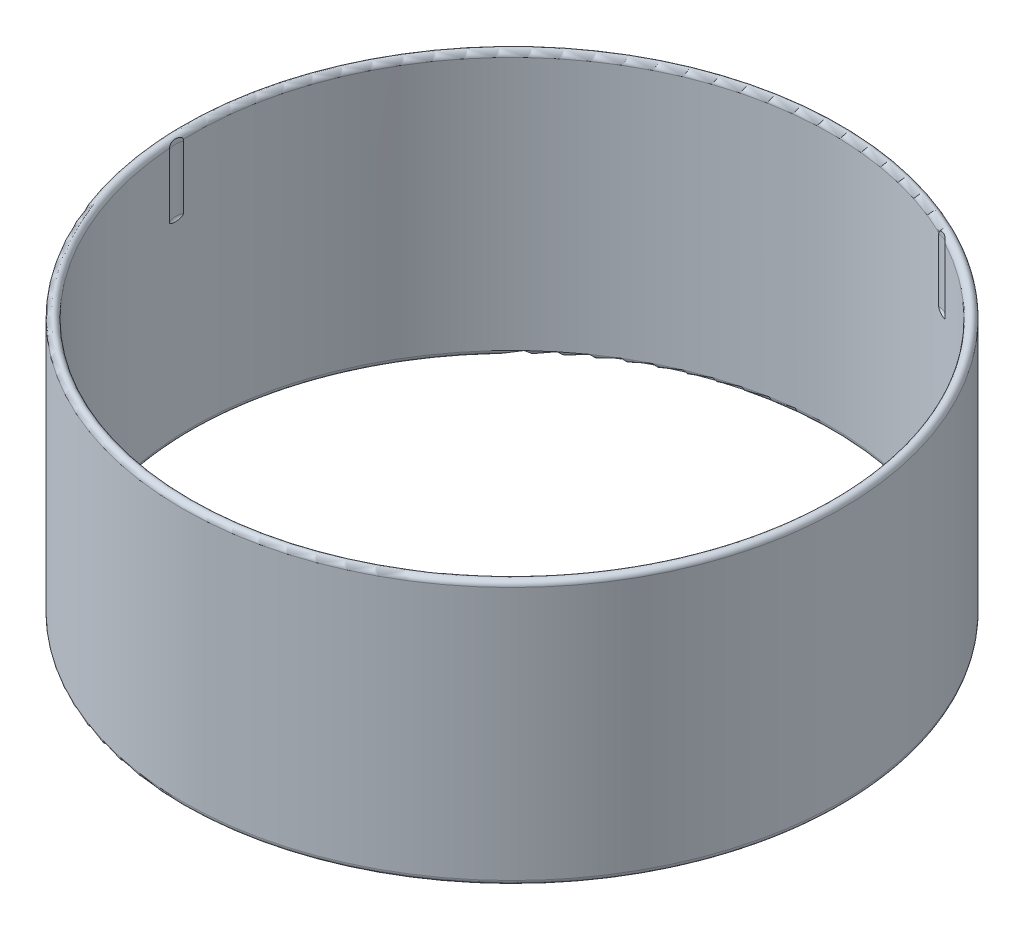
ISO-10303-21;
HEADER;
FILE_DESCRIPTION(('STEP AP214'),'2;1');
FILE_NAME('part.step','',(''),(''),'','','');
FILE_SCHEMA(('AUTOMOTIVE_DESIGN { 1 0 10303 214 1 1 1 1 }'));
ENDSEC;
DATA;
#1=APPLICATION_CONTEXT('core data for automotive mechanical design processes');
#2=APPLICATION_PROTOCOL_DEFINITION('international standard','automotive_design',2000,#1);
#3=PRODUCT_CONTEXT('',#1,'mechanical');
#4=PRODUCT('Part','Part','',(#3));
#5=PRODUCT_RELATED_PRODUCT_CATEGORY('part','',(#4));
#6=PRODUCT_DEFINITION_FORMATION('','',#4);
#7=PRODUCT_DEFINITION_CONTEXT('part definition',#1,'design');
#8=PRODUCT_DEFINITION('design','',#6,#7);
#9=PRODUCT_DEFINITION_SHAPE('','',#8);
#10=(LENGTH_UNIT() NAMED_UNIT(*) SI_UNIT(.MILLI.,.METRE.));
#11=(NAMED_UNIT(*) PLANE_ANGLE_UNIT() SI_UNIT($,.RADIAN.));
#12=(NAMED_UNIT(*) SI_UNIT($,.STERADIAN.) SOLID_ANGLE_UNIT());
#13=UNCERTAINTY_MEASURE_WITH_UNIT(LENGTH_MEASURE(1.E-05),#10,'distance_accuracy_value','');
#14=(GEOMETRIC_REPRESENTATION_CONTEXT(3) GLOBAL_UNCERTAINTY_ASSIGNED_CONTEXT((#13)) GLOBAL_UNIT_ASSIGNED_CONTEXT((#10,
#11,#12)) REPRESENTATION_CONTEXT('',''));
#15=CARTESIAN_POINT('',(0.,0.,0.));
#16=DIRECTION('',(0.,0.,1.));
#17=DIRECTION('',(1.,0.,0.));
#18=AXIS2_PLACEMENT_3D('',#15,#16,#17);
#19=CARTESIAN_POINT('',(0.,1.5,0.));
#20=DIRECTION('',(0.,1.,0.));
#21=DIRECTION('',(0.,0.,1.));
#22=AXIS2_PLACEMENT_3D('',#19,#20,#21);
#23=TOROIDAL_SURFACE('',#22,98.5,1.5);
#24=CARTESIAN_POINT('',(0.,1.5,0.));
#25=DIRECTION('',(0.,1.,0.));
#26=DIRECTION('',(0.,0.,1.));
#27=AXIS2_PLACEMENT_3D('',#24,#25,#26);
#28=CIRCLE('',#27,97.);
#29=CARTESIAN_POINT('',(0.,1.5,97.));
#30=VERTEX_POINT('',#29);
#31=EDGE_CURVE('E301',#30,#30,#28,.F.);
#32=ORIENTED_EDGE('',*,*,#31,.F.);
#33=EDGE_LOOP('',(#32));
#34=FACE_BOUND('',#33,.T.);
#35=CARTESIAN_POINT('',(0.,1.5,0.));
#36=DIRECTION('',(0.,1.,0.));
#37=DIRECTION('',(0.,0.,1.));
#38=AXIS2_PLACEMENT_3D('',#35,#36,#37);
#39=CIRCLE('',#38,100.);
#40=CARTESIAN_POINT('',(0.,1.5,100.));
#41=VERTEX_POINT('',#40);
#42=EDGE_CURVE('E304',#41,#41,#39,.T.);
#43=ORIENTED_EDGE('',*,*,#42,.F.);
#44=EDGE_LOOP('',(#43));
#45=FACE_BOUND('',#44,.T.);
#46=ADVANCED_FACE('F36',(#34,#45),#23,.T.);
#47=CARTESIAN_POINT('',(0.,78.5,0.));
#48=DIRECTION('',(0.,1.,0.));
#49=DIRECTION('',(0.,0.,1.));
#50=AXIS2_PLACEMENT_3D('',#47,#48,#49);
#51=TOROIDAL_SURFACE('',#50,98.5,1.5);
#52=CARTESIAN_POINT('',(46.0526689578262,78.4998,-85.3706722736065));
#53=CARTESIAN_POINT('',(46.0497318124486,78.5363804675937,-85.3722117880354));
#54=CARTESIAN_POINT('',(46.0445230225239,78.5725029843991,-85.3765738617317));
#55=CARTESIAN_POINT('',(46.0302037274335,78.6426342225058,-85.3900551772551));
#56=CARTESIAN_POINT('',(46.0211374033063,78.6766620313381,-85.3991207989001));
#57=CARTESIAN_POINT('',(45.9971008853054,78.750052194417,-85.4238148537515));
#58=CARTESIAN_POINT('',(45.9812396720261,78.7887604407255,-85.4404909469855));
#59=CARTESIAN_POINT('',(45.945455545345,78.8620762037317,-85.4782323530799));
#60=CARTESIAN_POINT('',(45.9255137948917,78.8966634807189,-85.4993180322984));
#61=CARTESIAN_POINT('',(45.8711014365537,78.9789261534468,-85.5563943795361));
#62=CARTESIAN_POINT('',(45.8345329825855,79.023819795135,-85.5943608111052));
#63=CARTESIAN_POINT('',(45.7562725476428,79.1052177906443,-85.6737072818365));
#64=CARTESIAN_POINT('',(45.7145715823291,79.1417071029764,-85.7150932640091));
#65=CARTESIAN_POINT('',(45.6322754479481,79.2039810730196,-85.7944610066269));
#66=CARTESIAN_POINT('',(45.5920914766667,79.2305105005739,-85.8322963574563));
#67=CARTESIAN_POINT('',(45.5092141406863,79.278971386234,-85.9081984662185));
#68=CARTESIAN_POINT('',(45.4665188920516,79.3008993345467,-85.9462653781675));
#69=CARTESIAN_POINT('',(45.3789554102592,79.3408559036101,-86.0220694880969));
#70=CARTESIAN_POINT('',(45.3340839935272,79.3588785869273,-86.0598061014744));
#71=CARTESIAN_POINT('',(45.2424847805717,79.3915307003894,-86.1344964987254));
#72=CARTESIAN_POINT('',(45.1957563909158,79.406159035422,-86.1714500264692));
#73=CARTESIAN_POINT('',(45.0697055860335,79.441009796282,-86.2679700190044));
#74=CARTESIAN_POINT('',(44.9889567399312,79.4586798351457,-86.3266067287086));
#75=CARTESIAN_POINT('',(44.8236466493903,79.4873164640379,-86.4400575139886));
#76=CARTESIAN_POINT('',(44.7390830792359,79.4982789036921,-86.4948692042638));
#77=CARTESIAN_POINT('',(44.5664830190604,79.5143098870105,-86.6002380937818));
#78=CARTESIAN_POINT('',(44.4784374551268,79.519361816571,-86.6507829313856));
#79=CARTESIAN_POINT('',(44.2996449377728,79.5238808151474,-86.7470462396979));
#80=CARTESIAN_POINT('',(44.208898766135,79.5233494850438,-86.7927660900712));
#81=CARTESIAN_POINT('',(44.0222543350958,79.5165609786111,-86.8805276478198));
#82=CARTESIAN_POINT('',(43.9262843214794,79.5101195432418,-86.9224030052652));
#83=CARTESIAN_POINT('',(43.7326549571873,79.4907478843276,-87.0005739549675));
#84=CARTESIAN_POINT('',(43.6349946205416,79.4778137413431,-87.0368661595442));
#85=CARTESIAN_POINT('',(43.439556125583,79.4445259343911,-87.1035274686093));
#86=CARTESIAN_POINT('',(43.3417820341519,79.4242163297037,-87.1339301354788));
#87=CARTESIAN_POINT('',(43.1469979655608,79.3745356774544,-87.1890082488424));
#88=CARTESIAN_POINT('',(43.049987017617,79.3451791499324,-87.2136927623901));
#89=CARTESIAN_POINT('',(42.8945225871839,79.2879327485536,-87.2493153415692));
#90=CARTESIAN_POINT('',(42.835161535731,79.2635664439894,-87.2619496253971));
#91=CARTESIAN_POINT('',(42.7184632931691,79.209312071544,-87.2850936513934));
#92=CARTESIAN_POINT('',(42.6611280382264,79.1794188827369,-87.2956014041589));
#93=CARTESIAN_POINT('',(42.5494983942893,79.1127464765747,-87.3146573224997));
#94=CARTESIAN_POINT('',(42.4952349424872,79.0759093897746,-87.3231875690532));
#95=CARTESIAN_POINT('',(42.3927293658045,78.9942109365045,-87.3383267268278));
#96=CARTESIAN_POINT('',(42.3444749213259,78.9493664622457,-87.3449396072842));
#97=CARTESIAN_POINT('',(42.275107947055,78.8702247272961,-87.3542075029825));
#98=CARTESIAN_POINT('',(42.2508165096778,78.8387881072156,-87.3573925706827));
#99=CARTESIAN_POINT('',(42.2071642139957,78.7727094411474,-87.3632150792198));
#100=CARTESIAN_POINT('',(42.1877857506938,78.738079464653,-87.3658544689606));
#101=CARTESIAN_POINT('',(42.1572423316299,78.6702394903955,-87.3703681698787));
#102=CARTESIAN_POINT('',(42.1453716063363,78.6373562201581,-87.3722962535623));
#103=CARTESIAN_POINT('',(42.1272421162013,78.5697284247038,-87.3758169493858));
#104=CARTESIAN_POINT('',(42.121039981762,78.5349687148896,-87.3774060572301));
#105=CARTESIAN_POINT('',(42.1181801112924,78.4998,-87.3788241320482));
#106=B_SPLINE_CURVE_WITH_KNOTS('',3,(#52,#53,#54,#55,#56,#57,#58,#59,#60,#61,#62,#63,#64,#65,
#66,#67,#68,#69,#70,#71,#72,#73,#74,#75,#76,#77,#78,#79,#80,#81,#82,#83,#84,#85,#86,#87,#88,#89,
#90,#91,#92,#93,#94,#95,#96,#97,#98,#99,#100,#101,#102,#103,#104,#105),.UNSPECIFIED.,.F.,.F.,(4,
2,2,2,2,2,2,2,2,2,2,2,2,2,2,2,2,2,2,2,2,2,2,2,2,2,4),(0.,0.109785182005368,0.218345457440619,
0.35270564638363,0.487700674504924,0.694259618754482,0.901185424044051,1.08463744540245,
1.2682288908119,1.45209753389321,1.63602541594606,1.93961699039069,2.24339622479165,
2.54802732901019,2.85257108915142,3.16694457847921,3.48150807364142,3.79422254589519,
4.10643771189373,4.30240635725232,4.49855749536604,4.69642203964654,4.89387400129358,
5.01309541361737,5.13188337309007,5.23644346874143,5.34203707380467),.UNSPECIFIED.);
#107=CARTESIAN_POINT('',(46.0526526591037,78.4999999999904,-85.3706810506976));
#108=VERTEX_POINT('',#107);
#109=CARTESIAN_POINT('',(42.1181967811361,78.4999999999998,-87.3788160820774));
#110=VERTEX_POINT('',#109);
#111=EDGE_CURVE('E198',#108,#110,#106,.T.);
#112=ORIENTED_EDGE('',*,*,#111,.F.);
#113=CARTESIAN_POINT('',(0.,78.5,0.));
#114=DIRECTION('',(0.,1.,0.));
#115=DIRECTION('',(0.,0.,1.));
#116=AXIS2_PLACEMENT_3D('',#113,#114,#115);
#117=CIRCLE('',#116,97.);
#118=CARTESIAN_POINT('',(54.6131760891201,78.4999999999999,80.1648364150939));
#119=VERTEX_POINT('',#118);
#120=EDGE_CURVE('E274',#119,#108,#117,.T.);
#121=ORIENTED_EDGE('',*,*,#120,.F.);
#122=CARTESIAN_POINT('',(50.9068364481866,78.4997999999998,82.5681173663554));
#123=CARTESIAN_POINT('',(50.9096382794803,78.5363804675935,82.5663434810582));
#124=CARTESIAN_POINT('',(50.9160203410768,78.5725029843989,82.5640135735086));
#125=CARTESIAN_POINT('',(50.9348551503417,78.6426342225056,82.5583533579577));
#126=CARTESIAN_POINT('',(50.947239371051,78.6766620313379,82.5550345017671));
#127=CARTESIAN_POINT('',(50.9806433088751,78.7500521944168,82.5465652939855));
#128=CARTESIAN_POINT('',(51.0030158358912,78.7887604407253,82.5411671269678));
#129=CARTESIAN_POINT('',(51.0535929156841,78.8620762037315,82.529047867257));
#130=CARTESIAN_POINT('',(51.08182452477,78.8966634807187,82.5223206443778));
#131=CARTESIAN_POINT('',(51.158460270602,78.9789261534466,82.503736333396));
#132=CARTESIAN_POINT('',(51.209624391816,79.0238197951348,82.491050339067));
#133=CARTESIAN_POINT('',(51.3174706686412,79.1052177906441,82.4629480496612));
#134=CARTESIAN_POINT('',(51.37416246322,79.1417071029761,82.4475269454235));
#135=CARTESIAN_POINT('',(51.4840450117585,79.2039810730193,82.4159402737251));
#136=CARTESIAN_POINT('',(51.5369033723785,79.2305105005736,82.4000576091853));
#137=CARTESIAN_POINT('',(51.6440751947575,79.2789713862338,82.3662347852094));
#138=CARTESIAN_POINT('',(51.6983897318663,79.3008993345465,82.3482930712454));
#139=CARTESIAN_POINT('',(51.8078197576725,79.34085590361,82.310362926534));
#140=CARTESIAN_POINT('',(51.8629363318762,79.3588785869271,82.2903714464291));
#141=CARTESIAN_POINT('',(51.973419719792,79.3915307003892,82.2483893996685));
#142=CARTESIAN_POINT('',(52.0287866084055,79.4061590354219,82.2263981910205));
#143=CARTESIAN_POINT('',(52.1754007763552,79.4410097962818,82.1654949880926));
#144=CARTESIAN_POINT('',(52.2665560796045,79.4586798351456,82.1248827908939));
#145=CARTESIAN_POINT('',(52.4474623870066,79.4873164640378,82.0384454456236));
#146=CARTESIAN_POINT('',(52.5372124882865,79.4982789036921,81.9926170907729));
#147=CARTESIAN_POINT('',(52.7147646534654,79.5143098870105,81.8958254987252));
#148=CARTESIAN_POINT('',(52.8025605488272,79.519361816571,81.8448482224701));
#149=CARTESIAN_POINT('',(52.975323277955,79.5238808151474,81.7381410145912));
#150=CARTESIAN_POINT('',(53.0602909156543,79.5233494850439,81.6824124498434));
#151=CARTESIAN_POINT('',(53.2296168696599,79.5165609786113,81.5646544099629));
#152=CARTESIAN_POINT('',(53.3138669998084,79.510119543242,81.5024796188923));
#153=CARTESIAN_POINT('',(53.4783797102346,79.4907478843278,81.3738771453479));
#154=CARTESIAN_POINT('',(53.5586398496802,79.4778137413434,81.307446915159));
#155=CARTESIAN_POINT('',(53.7140894842595,79.4445259343914,81.17152286818));
#156=CARTESIAN_POINT('',(53.7893060118268,79.4242163297041,81.1020493546035));
#157=CARTESIAN_POINT('',(53.9343970914877,79.3745356774549,80.960900459633));
#158=CARTESIAN_POINT('',(54.004279981272,79.345179149933,80.8892287710424));
#159=CARTESIAN_POINT('',(54.1128622550061,79.2879327485542,80.7724039144919));
#160=CARTESIAN_POINT('',(54.1534843914862,79.2635664439901,80.7273128778522));
#161=CARTESIAN_POINT('',(54.2318768272259,79.2093120715447,80.6378212482146));
#162=CARTESIAN_POINT('',(54.269644435529,79.1794188827376,80.5934213372845));
#163=CARTESIAN_POINT('',(54.3419621668732,79.1127464765755,80.5062751889899));
#164=CARTESIAN_POINT('',(54.3764813029902,79.0759093897754,80.4635467845089));
#165=CARTESIAN_POINT('',(54.4408449865563,78.9942109365053,80.3823439299593));
#166=CARTESIAN_POINT('',(54.4706991312632,78.9493664622465,80.3438607954235));
#167=CARTESIAN_POINT('',(54.513408851513,78.8702247272968,80.2884211813702));
#168=CARTESIAN_POINT('',(54.5283129197428,78.8387881072164,80.2689767133572));
#169=CARTESIAN_POINT('',(54.5551815078908,78.7727094411481,80.2340839706314));
#170=CARTESIAN_POINT('',(54.5671565181078,78.7380794646538,80.2186214239961));
#171=CARTESIAN_POINT('',(54.5863372073,78.6702394903962,80.1944268976272));
#172=CARTESIAN_POINT('',(54.5939423393974,78.6373562201586,80.1851105898033));
#173=CARTESIAN_POINT('',(54.6060560964872,78.5697284247041,80.1711703387004));
#174=CARTESIAN_POINT('',(54.6105333714694,78.5349687148897,80.1665936866404));
#175=CARTESIAN_POINT('',(54.6131913955211,78.4998,80.1648260035712));
#176=B_SPLINE_CURVE_WITH_KNOTS('',3,(#122,#123,#124,#125,#126,#127,#128,#129,#130,#131,#132,
#133,#134,#135,#136,#137,#138,#139,#140,#141,#142,#143,#144,#145,#146,#147,#148,#149,#150,#151,
#152,#153,#154,#155,#156,#157,#158,#159,#160,#161,#162,#163,#164,#165,#166,#167,#168,#169,#170,
#171,#172,#173,#174,#175),.UNSPECIFIED.,.F.,.F.,(4,2,2,2,2,2,2,2,2,2,2,2,2,2,2,2,2,2,2,2,2,2,2,
2,2,2,4),(0.,0.109785182005333,0.218345457440581,0.352705646383552,0.487700674504803,
0.694259618754261,0.901185424043722,1.08463744540202,1.26822889081137,1.45209753389258,
1.63602541594532,1.93961699038986,2.24339622479075,2.5480273290092,2.85257108915032,
3.16694457847806,3.4815080736402,3.7942225458939,4.10643771189239,4.30240635725119,
4.49855749536511,4.69642203964578,4.89387400129302,5.0130954136169,5.13188337308968,
5.2364434687415,5.34203707380519),.UNSPECIFIED.);
#177=CARTESIAN_POINT('',(50.9068521987318,78.4999999999904,82.5681076397932));
#178=VERTEX_POINT('',#177);
#179=EDGE_CURVE('E117',#178,#119,#176,.T.);
#180=ORIENTED_EDGE('',*,*,#179,.F.);
#181=CARTESIAN_POINT('',(-96.7313728702552,78.4999999999998,7.2139796669835));
#182=VERTEX_POINT('',#181);
#183=EDGE_CURVE('E204',#182,#178,#117,.T.);
#184=ORIENTED_EDGE('',*,*,#183,.F.);
#185=CARTESIAN_POINT('',(-96.9595054060122,78.4998,2.80255490725111));
#186=CARTESIAN_POINT('',(-96.9593700919283,78.5363804675937,2.80586830697725));
#187=CARTESIAN_POINT('',(-96.9605433636002,78.5725029843991,2.81256028822315));
#188=CARTESIAN_POINT('',(-96.9650588777746,78.6426342225058,2.83170181929744));
#189=CARTESIAN_POINT('',(-96.9683767743567,78.6766620313381,2.844086297133));
#190=CARTESIAN_POINT('',(-96.9777441941799,78.750052194417,2.87724955976595));
#191=CARTESIAN_POINT('',(-96.9842555079168,78.7887604407255,2.89932382001761));
#192=CARTESIAN_POINT('',(-96.9990484610286,78.8620762037317,2.94918448582293));
#193=CARTESIAN_POINT('',(-97.0073383196612,78.8966634807189,2.9769973879207));
#194=CARTESIAN_POINT('',(-97.0295617071553,78.9789261534468,3.05265804614008));
#195=CARTESIAN_POINT('',(-97.044157374401,79.023819795135,3.10331047203825));
#196=CARTESIAN_POINT('',(-97.0737432162837,79.1052177906443,3.21075923217545));
#197=CARTESIAN_POINT('',(-97.0887340455489,79.1417071029763,3.26756631858576));
#198=CARTESIAN_POINT('',(-97.1163204597064,79.2039810730196,3.3785207329019));
#199=CARTESIAN_POINT('',(-97.128994849045,79.2305105005739,3.43223874827117));
#200=CARTESIAN_POINT('',(-97.1532893354437,79.278971386234,3.54196368100928));
#201=CARTESIAN_POINT('',(-97.1649086239178,79.3008993345467,3.5979723069223));
#202=CARTESIAN_POINT('',(-97.1867751679317,79.3408559036102,3.71170656156305));
#203=CARTESIAN_POINT('',(-97.1970203254034,79.3588785869273,3.76943465504551));
#204=CARTESIAN_POINT('',(-97.2159045003638,79.3915307003894,3.88610709905712));
#205=CARTESIAN_POINT('',(-97.2245429993214,79.406159035422,3.94505183544889));
#206=CARTESIAN_POINT('',(-97.2451063623889,79.4410097962819,4.10247503091215));
#207=CARTESIAN_POINT('',(-97.2555128195359,79.4586798351457,4.2017239378151));
#208=CARTESIAN_POINT('',(-97.2711090363972,79.4873164640379,4.40161206836534));
#209=CARTESIAN_POINT('',(-97.2762955675228,79.4982789036922,4.50225211349137));
#210=CARTESIAN_POINT('',(-97.2812476725261,79.5143098870106,4.70441259505716));
#211=CARTESIAN_POINT('',(-97.2809980039543,79.519361816571,4.80593470891603));
#212=CARTESIAN_POINT('',(-97.2749682157282,79.5238808151474,5.00890522510736));
#213=CARTESIAN_POINT('',(-97.2691896817898,79.5233494850438,5.11035364022844));
#214=CARTESIAN_POINT('',(-97.2518712047562,79.5165609786112,5.31587323785761));
#215=CARTESIAN_POINT('',(-97.2401513212882,79.5101195432419,5.41992338637368));
#216=CARTESIAN_POINT('',(-97.2110346674223,79.4907478843277,5.6266968096204));
#217=CARTESIAN_POINT('',(-97.1936344702222,79.4778137413432,5.72941924438602));
#218=CARTESIAN_POINT('',(-97.1536456098429,79.4445259343912,5.9320046004302));
#219=CARTESIAN_POINT('',(-97.1310880459791,79.4242163297038,6.03188078087622));
#220=CARTESIAN_POINT('',(-97.081395057049,79.3745356774545,6.22810778921032));
#221=CARTESIAN_POINT('',(-97.0542669988894,79.3451791499325,6.32446399134874));
#222=CARTESIAN_POINT('',(-97.0073848421903,79.2879327485537,6.47691142707823));
#223=CARTESIAN_POINT('',(-96.9886459272174,79.2635664439895,6.53463674754582));
#224=CARTESIAN_POINT('',(-96.9503401203951,79.2093120715441,6.6472724031796));
#225=CARTESIAN_POINT('',(-96.9307724737554,79.179418882737,6.70218006687523));
#226=CARTESIAN_POINT('',(-96.8914605611624,79.1127464765749,6.80838213351056));
#227=CARTESIAN_POINT('',(-96.8717162454772,79.0759093897748,6.85964078454495));
#228=CARTESIAN_POINT('',(-96.8335743523605,78.9942109365047,6.95598279686903));
#229=CARTESIAN_POINT('',(-96.8151740525887,78.9493664622458,7.00107881186124));
#230=CARTESIAN_POINT('',(-96.7885167985676,78.8702247272962,7.06578632161266));
#231=CARTESIAN_POINT('',(-96.7791294294201,78.8387881072158,7.08841585732584));
#232=CARTESIAN_POINT('',(-96.7623457218859,78.7727094411475,7.12913110858862));
#233=CARTESIAN_POINT('',(-96.754942268801,78.7380794646531,7.14723304496481));
#234=CARTESIAN_POINT('',(-96.7435795389292,78.6702394903956,7.17594127225163));
#235=CARTESIAN_POINT('',(-96.739313945733,78.6373562201582,7.18718566375906));
#236=CARTESIAN_POINT('',(-96.7332982126876,78.5697284247039,7.20464661068539));
#237=CARTESIAN_POINT('',(-96.7315733532305,78.5349687148896,7.21081237058968));
#238=CARTESIAN_POINT('',(-96.7313715068126,78.4998,7.21399812847699));
#239=B_SPLINE_CURVE_WITH_KNOTS('',3,(#185,#186,#187,#188,#189,#190,#191,#192,#193,#194,#195,
#196,#197,#198,#199,#200,#201,#202,#203,#204,#205,#206,#207,#208,#209,#210,#211,#212,#213,#214,
#215,#216,#217,#218,#219,#220,#221,#222,#223,#224,#225,#226,#227,#228,#229,#230,#231,#232,#233,
#234,#235,#236,#237,#238),.UNSPECIFIED.,.F.,.F.,(4,2,2,2,2,2,2,2,2,2,2,2,2,2,2,2,2,2,2,2,2,2,2,
2,2,2,4),(0.,0.109785182005345,0.218345457440617,0.352705646383611,0.487700674504912,
0.694259618754471,0.90118542404404,1.08463744540244,1.26822889081188,1.45209753389318,
1.636025415946,1.93961699039063,2.2433962247916,2.54802732901013,2.85257108915136,
3.16694457847915,3.48150807364135,3.79422254589511,4.10643771189365,4.30240635725227,
4.49855749536602,4.69642203964655,4.89387400129361,5.01309541361741,5.13188337309014,
5.23644346874158,5.34203707380488),.UNSPECIFIED.);
#240=CARTESIAN_POINT('',(-96.9595048578348,78.4999999999904,2.80257341090447));
#241=VERTEX_POINT('',#240);
#242=EDGE_CURVE('E181',#241,#182,#239,.T.);
#243=ORIENTED_EDGE('',*,*,#242,.F.);
#244=EDGE_CURVE('E271',#110,#241,#117,.T.);
#245=ORIENTED_EDGE('',*,*,#244,.F.);
#246=EDGE_LOOP('',(#112,#121,#180,#184,#243,#245));
#247=FACE_BOUND('',#246,.T.);
#248=CARTESIAN_POINT('',(0.,78.5,0.));
#249=DIRECTION('',(0.,1.,0.));
#250=DIRECTION('',(0.,0.,1.));
#251=AXIS2_PLACEMENT_3D('',#248,#249,#250);
#252=CIRCLE('',#251,100.);
#253=CARTESIAN_POINT('',(0.,78.5,100.));
#254=VERTEX_POINT('',#253);
#255=EDGE_CURVE('E275',#254,#254,#252,.F.);
#256=ORIENTED_EDGE('',*,*,#255,.F.);
#257=EDGE_LOOP('',(#256));
#258=FACE_BOUND('',#257,.T.);
#259=ADVANCED_FACE('F189',(#247,#258),#51,.T.);
#260=CARTESIAN_POINT('',(0.,80.,0.));
#261=DIRECTION('',(0.,-1.,0.));
#262=DIRECTION('',(0.,0.,-1.));
#263=AXIS2_PLACEMENT_3D('',#260,#261,#262);
#264=CYLINDRICAL_SURFACE('',#263,100.);
#265=ORIENTED_EDGE('',*,*,#42,.T.);
#266=EDGE_LOOP('',(#265));
#267=FACE_BOUND('',#266,.T.);
#268=ORIENTED_EDGE('',*,*,#255,.T.);
#269=EDGE_LOOP('',(#268));
#270=FACE_BOUND('',#269,.T.);
#271=ADVANCED_FACE('F194',(#267,#270),#264,.T.);
#272=CARTESIAN_POINT('',(0.,80.,0.));
#273=DIRECTION('',(0.,-1.,0.));
#274=DIRECTION('',(0.,0.,-1.));
#275=AXIS2_PLACEMENT_3D('',#272,#273,#274);
#276=CYLINDRICAL_SURFACE('',#275,97.);
#277=CARTESIAN_POINT('',(42.1182134894496,78.5002,-87.3788080283609));
#278=CARTESIAN_POINT('',(42.1112780698639,78.4169776373383,-87.3821503934874));
#279=CARTESIAN_POINT('',(42.1060792082879,78.3336664388117,-87.384655769895));
#280=CARTESIAN_POINT('',(42.0991546040042,78.1668664386655,-87.3879925438995));
#281=CARTESIAN_POINT('',(42.0974288584383,78.0833776371922,-87.3888239428741));
#282=CARTESIAN_POINT('',(42.0974396680236,77.9998000000001,-87.3888183545075));
#283=B_SPLINE_CURVE_WITH_KNOTS('',3,(#277,#278,#279,#280,#281,#282),.UNSPECIFIED.,.F.,.F.,(4,2,
4),(0.,0.250532528533159,0.501064850881359),.UNSPECIFIED.);
#284=CARTESIAN_POINT('',(42.0974396647221,78.0000000000001,-87.388818356098));
#285=VERTEX_POINT('',#284);
#286=EDGE_CURVE('E11',#110,#285,#283,.T.);
#287=ORIENTED_EDGE('',*,*,#286,.F.);
#288=ORIENTED_EDGE('',*,*,#244,.T.);
#289=CARTESIAN_POINT('',(-96.9601678443961,77.9998000000001,2.77954161446322));
#290=CARTESIAN_POINT('',(-96.9601685361602,78.0833776371922,2.77952946545348));
#291=CARTESIAN_POINT('',(-96.9601135885494,78.1668664386655,2.78144425076084));
#292=CARTESIAN_POINT('',(-96.9598924144867,78.3336664388117,2.78912769317143));
#293=CARTESIAN_POINT('',(-96.9597261879433,78.4169776373383,2.79489635344635));
#294=CARTESIAN_POINT('',(-96.9595043219334,78.5002,2.80259195121006));
#295=B_SPLINE_CURVE_WITH_KNOTS('',3,(#289,#290,#291,#292,#293,#294),.UNSPECIFIED.,.F.,.F.,(4,2,
4),(0.,0.250532322348172,0.501064850881332),.UNSPECIFIED.);
#296=CARTESIAN_POINT('',(-96.9601678445011,78.0000000000004,2.77954161080014));
#297=VERTEX_POINT('',#296);
#298=EDGE_CURVE('E122',#297,#241,#295,.T.);
#299=ORIENTED_EDGE('',*,*,#298,.F.);
#300=DIRECTION('',(0.,1.,0.));
#301=VECTOR('',#300,1.);
#302=CARTESIAN_POINT('',(-96.960167844501,68.5000000000001,2.77954161079964));
#303=LINE('',#302,#301);
#304=CARTESIAN_POINT('',(-96.960167844501,59.,2.77954161079965));
#305=VERTEX_POINT('',#304);
#306=EDGE_CURVE('E260',#305,#297,#303,.T.);
#307=ORIENTED_EDGE('',*,*,#306,.F.);
#308=CARTESIAN_POINT('',(-96.7296565389514,59.0002,7.23695694725958));
#309=CARTESIAN_POINT('',(-96.7296506817911,58.9744198963968,7.23703145678996));
#310=CARTESIAN_POINT('',(-96.7298292030514,58.9487071753443,7.23464924239203));
#311=CARTESIAN_POINT('',(-96.7305118772708,58.898300753384,7.2255177289523));
#312=CARTESIAN_POINT('',(-96.7310130990446,58.8735999876838,7.21880773941771));
#313=CARTESIAN_POINT('',(-96.7322974713299,58.8256883435595,7.2015758610368));
#314=CARTESIAN_POINT('',(-96.7330797736087,58.8024732275032,7.19106544036699));
#315=CARTESIAN_POINT('',(-96.7348725206271,58.7577065303581,7.16690917599664));
#316=CARTESIAN_POINT('',(-96.7358835047781,58.7361590468087,7.1532559176528));
#317=CARTESIAN_POINT('',(-96.7388204898117,58.6809896657303,7.11345389231347));
#318=CARTESIAN_POINT('',(-96.7409047305077,58.6489883376017,7.08507515037372));
#319=CARTESIAN_POINT('',(-96.7453752870578,58.5897290068509,7.02376764390875));
#320=CARTESIAN_POINT('',(-96.7477624146738,58.5624842365204,6.99082662955335));
#321=CARTESIAN_POINT('',(-96.7524239334187,58.5150836246454,6.92599409254155));
#322=CARTESIAN_POINT('',(-96.7546789732502,58.494471552557,6.8944286786565));
#323=CARTESIAN_POINT('',(-96.75927399546,58.4560336362098,6.82963800845027));
#324=CARTESIAN_POINT('',(-96.7616140470128,58.4382101265572,6.79641139173882));
#325=CARTESIAN_POINT('',(-96.7687082106668,58.3882897700842,6.69490050922306));
#326=CARTESIAN_POINT('',(-96.7735314650463,58.3597889799074,6.6248526421671));
#327=CARTESIAN_POINT('',(-96.7818058387205,58.3170773172631,6.50266791016411));
#328=CARTESIAN_POINT('',(-96.7852568597243,58.3011079301043,6.45110626130794));
#329=CARTESIAN_POINT('',(-96.79213119079,58.272202228013,6.34712938037768));
#330=CARTESIAN_POINT('',(-96.7955544971806,58.2592663087827,6.29471403789578));
#331=CARTESIAN_POINT('',(-96.8057601325372,58.2241692473319,6.13644710409939));
#332=CARTESIAN_POINT('',(-96.8124654787342,58.2057793699136,6.02976176888594));
#333=CARTESIAN_POINT('',(-96.825615722734,58.1760501088268,5.81479433817966));
#334=CARTESIAN_POINT('',(-96.8320587319362,58.1647554852131,5.70650643119565));
#335=CARTESIAN_POINT('',(-96.8445974945648,58.14764001601,5.48960150573038));
#336=CARTESIAN_POINT('',(-96.8506935837933,58.1418137896019,5.38098491649809));
#337=CARTESIAN_POINT('',(-96.8627439928411,58.1345488983665,5.15960891966101));
#338=CARTESIAN_POINT('',(-96.8686849251418,58.1332788902976,5.04684359519634));
#339=CARTESIAN_POINT('',(-96.8801737844549,58.1353703735295,4.82127419542173));
#340=CARTESIAN_POINT('',(-96.8857215102508,58.1387342183839,4.70847012953397));
#341=CARTESIAN_POINT('',(-96.8963737497757,58.1506442732329,4.48389394203984));
#342=CARTESIAN_POINT('',(-96.9014810770426,58.1591542864074,4.3721200988727));
#343=CARTESIAN_POINT('',(-96.911278355697,58.1827380491011,4.14928125939514));
#344=CARTESIAN_POINT('',(-96.9159686412232,58.1978064858137,4.03821576300832));
#345=CARTESIAN_POINT('',(-96.9232711016628,58.2298624188801,3.85803373860933));
#346=CARTESIAN_POINT('',(-96.9260155204563,58.2441285282223,3.78844330851348));
#347=CARTESIAN_POINT('',(-96.9313291750962,58.2773863721317,3.6499642900499));
#348=CARTESIAN_POINT('',(-96.9338974133146,58.2964025740273,3.58108132041483));
#349=CARTESIAN_POINT('',(-96.9380269473143,58.3333584507334,3.46713971054176));
#350=CARTESIAN_POINT('',(-96.9396459917396,58.3496696132428,3.42155809605062));
#351=CARTESIAN_POINT('',(-96.9427772641553,58.3856398089602,3.33165983450237));
#352=CARTESIAN_POINT('',(-96.9442893951038,58.4053018298114,3.28734435787419));
#353=CARTESIAN_POINT('',(-96.9471777801729,58.4484882814014,3.20102652629039));
#354=CARTESIAN_POINT('',(-96.9485549825843,58.4719821127063,3.15900910818888));
#355=CARTESIAN_POINT('',(-96.9511587211606,58.5237338203778,3.07805956662292));
#356=CARTESIAN_POINT('',(-96.9523856211093,58.5519797848478,3.03912007801582));
#357=CARTESIAN_POINT('',(-96.9542756837683,58.6039235709316,2.97809204436419));
#358=CARTESIAN_POINT('',(-96.9549913864706,58.6260529553315,2.95467902074303));
#359=CARTESIAN_POINT('',(-96.9563184219977,58.6731572846261,2.91080717932309));
#360=CARTESIAN_POINT('',(-96.9569296655957,58.698134632133,2.89035088938107));
#361=CARTESIAN_POINT('',(-96.9580273831948,58.7513429843533,2.8532919305765));
#362=CARTESIAN_POINT('',(-96.9585121330633,58.7796120437308,2.83674277934979));
#363=CARTESIAN_POINT('',(-96.9593101927994,58.8387519479093,2.80933412108339));
#364=CARTESIAN_POINT('',(-96.9596241814021,58.8696119209246,2.79845209600668));
#365=CARTESIAN_POINT('',(-96.9599465094347,58.9174371152345,2.78725437488554));
#366=CARTESIAN_POINT('',(-96.9600292305095,58.9338233728688,2.78437383898178));
#367=CARTESIAN_POINT('',(-96.9601401894299,58.9668672487564,2.78050640482715));
#368=CARTESIAN_POINT('',(-96.9601682613495,58.9835255390493,2.77952527360366));
#369=CARTESIAN_POINT('',(-96.9601678431547,59.0002,2.77954165776983));
#370=B_SPLINE_CURVE_WITH_KNOTS('',3,(#308,#309,#310,#311,#312,#313,#314,#315,#316,#317,#318,
#319,#320,#321,#322,#323,#324,#325,#326,#327,#328,#329,#330,#331,#332,#333,#334,#335,#336,#337,
#338,#339,#340,#341,#342,#343,#344,#345,#346,#347,#348,#349,#350,#351,#352,#353,#354,#355,#356,
#357,#358,#359,#360,#361,#362,#363,#364,#365,#366,#367,#368,#369),.UNSPECIFIED.,.F.,.F.,(4,2,2,
2,2,2,2,2,2,2,2,2,2,2,2,2,2,2,2,2,2,2,2,2,2,2,2,2,2,2,4),(0.,0.077119909894093,
0.153549014606177,0.229749385788498,0.306131407055271,0.433860582482006,0.56193961448775,
0.675072510243415,0.788299620671268,1.01499647932979,1.17718564368397,1.33939595312751,
1.66440511339611,1.9914445146006,2.31816177565927,2.65685503670889,2.99572038493226,
3.33222952378865,3.66846657131872,3.88162778165586,4.09591046448188,4.24112743428784,
4.38647456427054,4.53071323394927,4.6745955935669,4.77106484048272,4.86761608193748,
4.96542168478521,5.06283563848304,5.11264870649991,5.16261278264348),.UNSPECIFIED.);
#371=CARTESIAN_POINT('',(-96.7296565354455,59.,7.23695699411805));
#372=VERTEX_POINT('',#371);
#373=EDGE_CURVE('E255',#372,#305,#370,.T.);
#374=ORIENTED_EDGE('',*,*,#373,.F.);
#375=DIRECTION('',(0.,1.,0.));
#376=VECTOR('',#375,1.);
#377=CARTESIAN_POINT('',(-96.7296565354455,68.5000000000001,7.23695699411805));
#378=LINE('',#377,#376);
#379=CARTESIAN_POINT('',(-96.7296565354458,78.0000000000001,7.23695699411758));
#380=VERTEX_POINT('',#379);
#381=EDGE_CURVE('E239',#380,#372,#378,.F.);
#382=ORIENTED_EDGE('',*,*,#381,.F.);
#383=CARTESIAN_POINT('',(-96.7313742496889,78.5002,7.21396117030128));
#384=CARTESIAN_POINT('',(-96.7308011130044,78.4169776373383,7.22163860241155));
#385=CARTESIAN_POINT('',(-96.7303714018313,78.3336664388117,7.227393636811));
#386=CARTESIAN_POINT('',(-96.7297988307442,78.1668664386655,7.23505890703408));
#387=CARTESIAN_POINT('',(-96.7296559705939,78.0833776371922,7.23696914602192));
#388=CARTESIAN_POINT('',(-96.7296565357191,77.9998000000001,7.23695699046317));
#389=B_SPLINE_CURVE_WITH_KNOTS('',3,(#383,#384,#385,#386,#387,#388),.UNSPECIFIED.,.F.,.F.,(4,2,
4),(0.,0.250532528533159,0.501064850881344),.UNSPECIFIED.);
#390=EDGE_CURVE('E233',#182,#380,#389,.T.);
#391=ORIENTED_EDGE('',*,*,#390,.F.);
#392=ORIENTED_EDGE('',*,*,#183,.T.);
#393=CARTESIAN_POINT('',(50.8872375711996,77.9998000000001,82.5801977012183));
#394=CARTESIAN_POINT('',(50.8872273957306,78.0833776371921,82.5802043748084));
#395=CARTESIAN_POINT('',(50.8888581746441,78.1668664386654,82.5791993961279));
#396=CARTESIAN_POINT('',(50.8954016439288,78.3336664388116,82.5751661325657));
#397=CARTESIAN_POINT('',(50.900314337001,78.4169776373382,82.5721378460188));
#398=CARTESIAN_POINT('',(50.9068679871567,78.5001999999999,82.5680979055361));
#399=B_SPLINE_CURVE_WITH_KNOTS('',3,(#393,#394,#395,#396,#397,#398),.UNSPECIFIED.,.F.,.F.,(4,2,
4),(0.,0.25053232234813,0.501064850881233),.UNSPECIFIED.);
#400=CARTESIAN_POINT('',(50.8872375680797,78.0000000000004,82.5801977031408));
#401=VERTEX_POINT('',#400);
#402=EDGE_CURVE('E168',#401,#178,#399,.T.);
#403=ORIENTED_EDGE('',*,*,#402,.F.);
#404=DIRECTION('',(0.,1.,0.));
#405=VECTOR('',#404,1.);
#406=CARTESIAN_POINT('',(50.8872375680792,68.5000000000001,82.5801977031409));
#407=LINE('',#406,#405);
#408=CARTESIAN_POINT('',(50.8872375680793,59.,82.5801977031409));
#409=VERTEX_POINT('',#408);
#410=EDGE_CURVE('E130',#409,#401,#407,.T.);
#411=ORIENTED_EDGE('',*,*,#410,.F.);
#412=CARTESIAN_POINT('',(54.6322168318972,59.0002,80.1518613884455));
#413=CARTESIAN_POINT('',(54.6322784304631,58.9744198963968,80.1518190612306));
#414=CARTESIAN_POINT('',(54.6303046329074,58.9487071753443,80.1531647723761));
#415=CARTESIAN_POINT('',(54.6227378474033,58.898300753384,80.1583217423125));
#416=CARTESIAN_POINT('',(54.6171774368941,58.8735999876838,80.1621108078689));
#417=CARTESIAN_POINT('',(54.602896378604,58.8256883435595,80.1718390460863));
#418=CARTESIAN_POINT('',(54.5941852384388,58.8024732275032,80.177771750068));
#419=CARTESIAN_POINT('',(54.5741616733428,58.7577065303581,80.1914024467138));
#420=CARTESIAN_POINT('',(54.5628430968481,58.7361590468087,80.1991046138433));
#421=CARTESIAN_POINT('',(54.5298420242989,58.6809896657303,80.2215491301625));
#422=CARTESIAN_POINT('',(54.5063074331997,58.6489883376017,80.2375435065228));
#423=CARTESIAN_POINT('',(54.4554488534334,58.5897290068509,80.2720688752966));
#424=CARTESIAN_POINT('',(54.4281146619832,58.5624842365204,80.2906066956319));
#425=CARTESIAN_POINT('',(54.3742987973117,58.5150836246454,80.3270599577911));
#426=CARTESIAN_POINT('',(54.348089866922,58.4944715525571,80.3447955865142));
#427=CARTESIAN_POINT('',(54.2942770117001,58.4560336362098,80.381170327582));
#428=CARTESIAN_POINT('',(54.2666719433226,58.4382101265572,80.3998101800286));
#429=CARTESIAN_POINT('',(54.1823080221303,58.3882897700842,80.4567093472294));
#430=CARTESIAN_POINT('',(54.1240564169687,58.3597889799074,80.4959103415789));
#431=CARTESIAN_POINT('',(54.0223785219367,58.3170773172631,80.5641685253828));
#432=CARTESIAN_POINT('',(53.9794503346681,58.3011079301043,80.5929380216691));
#433=CARTESIAN_POINT('',(53.8928408799091,58.272202228013,80.6508798074711));
#434=CARTESIAN_POINT('',(53.849159514967,58.2592663087827,80.6800521490113));
#435=CARTESIAN_POINT('',(53.7171991473985,58.2241692473319,80.76802395539));
#436=CARTESIAN_POINT('',(53.6281596099909,58.2057793699136,80.8271736231445));
#437=CARTESIAN_POINT('',(53.4485674760129,58.1760501088268,80.9460457838675));
#438=CARTESIAN_POINT('',(53.3580089022433,58.1647554852131,81.0057695470054));
#439=CARTESIAN_POINT('',(53.1764331078987,58.14764001601,81.1250808967064));
#440=CARTESIAN_POINT('',(53.0854164269654,58.1418137896019,81.1846685594582));
#441=CARTESIAN_POINT('',(52.8997243944402,58.1345488983665,81.3057925182381));
#442=CARTESIAN_POINT('',(52.8050372249382,58.1332788902976,81.367320178765));
#443=CARTESIAN_POINT('',(52.6154328240736,58.1353703735295,81.4900545226779));
#444=CARTESIAN_POINT('',(52.5205155002626,58.1387342183838,81.5512610270943));
#445=CARTESIAN_POINT('',(52.3313529365701,58.1506442732329,81.6727742308771));
#446=CARTESIAN_POINT('',(52.2371076125422,58.1591542864074,81.7330842276192));
#447=CARTESIAN_POINT('',(52.049022155932,58.1827380491011,81.8529883395607));
#448=CARTESIAN_POINT('',(51.9551817573402,58.1978064858137,81.9125829941708));
#449=CARTESIAN_POINT('',(51.8027907771252,58.22986241888,82.0089981226211));
#450=CARTESIAN_POINT('',(51.7438959061986,58.2441285282222,82.0461700740628));
#451=CARTESIAN_POINT('',(51.6266263856379,58.2773863721316,82.1200113431997));
#452=CARTESIAN_POINT('',(51.568256103155,58.2964025740272,82.1566769875574));
#453=CARTESIAN_POINT('',(51.4716445414567,58.3333584507333,82.2172240738435));
#454=CARTESIAN_POINT('',(51.4329792275745,58.3496696132427,82.2414170146912));
#455=CARTESIAN_POINT('',(51.3566906855255,58.3856398089601,82.2890779069235));
#456=CARTESIAN_POINT('',(51.3190684224589,58.4053018298113,82.3125451890528));
#457=CARTESIAN_POINT('',(51.2457591800422,58.4484882814013,82.3582055196905));
#458=CARTESIAN_POINT('',(51.2100596297706,58.4719821127063,82.3804069210157));
#459=CARTESIAN_POINT('',(51.1412571396378,58.5237338203778,82.4231365955506));
#460=CARTESIAN_POINT('',(51.1081480032681,58.5519797848477,82.4436688663777));
#461=CARTESIAN_POINT('',(51.0562412071122,58.6039235709315,82.4758197254809));
#462=CARTESIAN_POINT('',(51.0363227852281,58.6260529553315,82.4881460540132));
#463=CARTESIAN_POINT('',(50.9989921738111,58.6731572846261,82.5112312212013));
#464=CARTESIAN_POINT('',(50.9815821288531,58.6981346321329,82.5219887186561));
#465=CARTESIAN_POINT('',(50.9500369878901,58.7513429843532,82.5414688493854));
#466=CARTESIAN_POINT('',(50.935947377451,58.7796120437307,82.5501632306994));
#467=CARTESIAN_POINT('',(50.9126098129767,58.8387519479093,82.5645586998378));
#468=CARTESIAN_POINT('',(50.903342697117,58.8696119209245,82.5702716344826));
#469=CARTESIAN_POINT('',(50.8938063501779,58.9174371152345,82.5761496393078));
#470=CARTESIAN_POINT('',(50.8913530934461,58.9338233728688,82.5776615458119));
#471=CARTESIAN_POINT('',(50.8880592766809,58.9668672487564,82.579691356133));
#472=CARTESIAN_POINT('',(50.8872236280767,58.9835255390493,82.5802062327402));
#473=CARTESIAN_POINT('',(50.8872376080834,59.0002,82.5801976784899));
#474=B_SPLINE_CURVE_WITH_KNOTS('',3,(#412,#413,#414,#415,#416,#417,#418,#419,#420,#421,#422,
#423,#424,#425,#426,#427,#428,#429,#430,#431,#432,#433,#434,#435,#436,#437,#438,#439,#440,#441,
#442,#443,#444,#445,#446,#447,#448,#449,#450,#451,#452,#453,#454,#455,#456,#457,#458,#459,#460,
#461,#462,#463,#464,#465,#466,#467,#468,#469,#470,#471,#472,#473),.UNSPECIFIED.,.F.,.F.,(4,2,2,
2,2,2,2,2,2,2,2,2,2,2,2,2,2,2,2,2,2,2,2,2,2,2,2,2,2,2,4),(0.,0.0771199098940926,
0.15354901460618,0.229749385788498,0.306131407055271,0.433860582481998,0.561939614487726,
0.675072510243375,0.78829962067122,1.01499647932973,1.17718564368391,1.33939595312743,
1.66440511339602,1.99144451460049,2.31816177565914,2.65685503670871,2.99572038493202,
3.33222952378835,3.66846657131837,3.88162778165558,4.09591046448166,4.24112743428767,
4.38647456427043,4.53071323394921,4.6745955935669,4.7710648404827,4.86761608193748,
4.96542168478521,5.06283563848303,5.11264870649995,5.16261278264354),.UNSPECIFIED.);
#475=CARTESIAN_POINT('',(54.6322168707248,59.,80.15186136198));
#476=VERTEX_POINT('',#475);
#477=EDGE_CURVE('E138',#476,#409,#474,.T.);
#478=ORIENTED_EDGE('',*,*,#477,.F.);
#479=DIRECTION('',(0.,1.,0.));
#480=VECTOR('',#479,1.);
#481=CARTESIAN_POINT('',(54.6322168707248,68.5000000000001,80.15186136198));
#482=LINE('',#481,#480);
#483=CARTESIAN_POINT('',(54.6322168707245,78.0000000000001,80.1518613619804));
#484=VERTEX_POINT('',#483);
#485=EDGE_CURVE('E123',#484,#476,#482,.F.);
#486=ORIENTED_EDGE('',*,*,#485,.F.);
#487=CARTESIAN_POINT('',(54.6131607602403,78.5001999999999,80.1648468580596));
#488=CARTESIAN_POINT('',(54.6195230431413,78.4169776373382,80.1605117910758));
#489=CARTESIAN_POINT('',(54.6242921935444,78.3336664388116,80.157262133084));
#490=CARTESIAN_POINT('',(54.6306442267408,78.1668664386655,80.1529336368655));
#491=CARTESIAN_POINT('',(54.6322271121564,78.0833776371921,80.1518547968522));
#492=CARTESIAN_POINT('',(54.6322168676964,77.9998000000001,80.1518613640444));
#493=B_SPLINE_CURVE_WITH_KNOTS('',3,(#487,#488,#489,#490,#491,#492),.UNSPECIFIED.,.F.,.F.,(4,2,
4),(0.,0.250532528533104,0.501064850881248),.UNSPECIFIED.);
#494=EDGE_CURVE('E111',#119,#484,#493,.T.);
#495=ORIENTED_EDGE('',*,*,#494,.F.);
#496=ORIENTED_EDGE('',*,*,#120,.T.);
#497=CARTESIAN_POINT('',(46.0729302731972,77.9998000000001,-85.3597393156815));
#498=CARTESIAN_POINT('',(46.0729411404304,78.0833776371922,-85.359733840262));
#499=CARTESIAN_POINT('',(46.071255413906,78.1668664386655,-85.3606436468888));
#500=CARTESIAN_POINT('',(46.0644907705585,78.3336664388117,-85.3642938257371));
#501=CARTESIAN_POINT('',(46.059411850943,78.4169776373383,-85.3670341994652));
#502=CARTESIAN_POINT('',(46.0526363347773,78.5002,-85.3706898567462));
#503=B_SPLINE_CURVE_WITH_KNOTS('',3,(#497,#498,#499,#500,#501,#502),.UNSPECIFIED.,.F.,.F.,(4,2,
4),(0.,0.250532322348186,0.501064850881344),.UNSPECIFIED.);
#504=CARTESIAN_POINT('',(46.0729302764221,78.0000000000001,-85.3597393139409));
#505=VERTEX_POINT('',#504);
#506=EDGE_CURVE('E50',#505,#108,#503,.T.);
#507=ORIENTED_EDGE('',*,*,#506,.F.);
#508=DIRECTION('',(0.,1.,0.));
#509=VECTOR('',#508,1.);
#510=CARTESIAN_POINT('',(46.0729302764225,68.5000000000001,-85.3597393139405));
#511=LINE('',#510,#509);
#512=CARTESIAN_POINT('',(46.0729302764222,59.,-85.3597393139408));
#513=VERTEX_POINT('',#512);
#514=EDGE_CURVE('E223',#513,#505,#511,.T.);
#515=ORIENTED_EDGE('',*,*,#514,.F.);
#516=CARTESIAN_POINT('',(42.0974397070552,59.0002,-87.388818335705));
#517=CARTESIAN_POINT('',(42.0973722513289,58.9744198963968,-87.3888505180206));
#518=CARTESIAN_POINT('',(42.0995245701449,58.9487071753443,-87.3878140147682));
#519=CARTESIAN_POINT('',(42.1077740298684,58.898300753384,-87.3838394712648));
#520=CARTESIAN_POINT('',(42.1138356621514,58.8735999876838,-87.3809185472866));
#521=CARTESIAN_POINT('',(42.1294010927268,58.8256883435596,-87.3734149071231));
#522=CARTESIAN_POINT('',(42.1388945351707,58.8024732275032,-87.368837190435));
#523=CARTESIAN_POINT('',(42.1607108472852,58.7577065303581,-87.3583116227104));
#524=CARTESIAN_POINT('',(42.1730404079309,58.7361590468087,-87.352360531496));
#525=CARTESIAN_POINT('',(42.2089784655136,58.6809896657303,-87.3350030224759));
#526=CARTESIAN_POINT('',(42.2345972973089,58.6489883376017,-87.3226186568965));
#527=CARTESIAN_POINT('',(42.2899264336253,58.589729006851,-87.2958365192054));
#528=CARTESIAN_POINT('',(42.3196477526915,58.5624842365204,-87.2814333251853));
#529=CARTESIAN_POINT('',(42.3781251361079,58.5150836246454,-87.2530540503327));
#530=CARTESIAN_POINT('',(42.4065891063291,58.4944715525571,-87.2392242651707));
#531=CARTESIAN_POINT('',(42.4649969837608,58.4560336362099,-87.2108083360323));
#532=CARTESIAN_POINT('',(42.4949421036911,58.4382101265572,-87.1962215717675));
#533=CARTESIAN_POINT('',(42.5864001885373,58.3882897700842,-87.1516098564525));
#534=CARTESIAN_POINT('',(42.6494750480785,58.3597889799074,-87.1207629837461));
#535=CARTESIAN_POINT('',(42.7594273167848,58.3170773172631,-87.0668364355469));
#536=CARTESIAN_POINT('',(42.8058065250571,58.3011079301043,-87.044044282977));
#537=CARTESIAN_POINT('',(42.8992903108818,58.272202228013,-86.9980091878489));
#538=CARTESIAN_POINT('',(42.9463949822145,58.2592663087827,-86.9747661869071));
#539=CARTESIAN_POINT('',(43.0885609851395,58.2241692473319,-86.9044710594895));
#540=CARTESIAN_POINT('',(43.1843058687441,58.2057793699136,-86.8569353920305));
#541=CARTESIAN_POINT('',(43.3770482467219,58.1760501088269,-86.7608401220472));
#542=CARTESIAN_POINT('',(43.4740498296938,58.1647554852132,-86.7122759782012));
#543=CARTESIAN_POINT('',(43.668164386667,58.14764001601,-86.6146824024369));
#544=CARTESIAN_POINT('',(43.7652771568288,58.1418137896019,-86.5656534759564));
#545=CARTESIAN_POINT('',(43.9630195984017,58.1345488983666,-86.4654014378992));
#546=CARTESIAN_POINT('',(44.0636477002044,58.1332788902976,-86.4141637739615));
#547=CARTESIAN_POINT('',(44.2647409603822,58.1353703735296,-86.3113287180998));
#548=CARTESIAN_POINT('',(44.3652060099891,58.1387342183839,-86.2597311566284));
#549=CARTESIAN_POINT('',(44.5650208132065,58.1506442732329,-86.1566681729171));
#550=CARTESIAN_POINT('',(44.6643734645013,58.1591542864074,-86.1052043264921));
#551=CARTESIAN_POINT('',(44.8622561997659,58.1827380491011,-86.002269598956));
#552=CARTESIAN_POINT('',(44.9607868838839,58.1978064858137,-85.9507987571793));
#553=CARTESIAN_POINT('',(45.1204803245385,58.2298624188801,-85.8670318612306));
#554=CARTESIAN_POINT('',(45.1821196142586,58.2441285282223,-85.8346133825765));
#555=CARTESIAN_POINT('',(45.3047027894591,58.2773863721317,-85.7699756332498));
#556=CARTESIAN_POINT('',(45.3656413101605,58.2964025740273,-85.7377583079724));
#557=CARTESIAN_POINT('',(45.4663824058585,58.3333584507334,-85.6843637843854));
#558=CARTESIAN_POINT('',(45.506666764166,58.3496696132428,-85.662975110742));
#559=CARTESIAN_POINT('',(45.5860865786307,58.3856398089602,-85.620737741426));
#560=CARTESIAN_POINT('',(45.6252209726457,58.4053018298114,-85.5998895469271));
#561=CARTESIAN_POINT('',(45.7014186001315,58.4484882814014,-85.5592320459809));
#562=CARTESIAN_POINT('',(45.7384953528145,58.4719821127063,-85.5394160292046));
#563=CARTESIAN_POINT('',(45.8099015815235,58.5237338203779,-85.5011961621735));
#564=CARTESIAN_POINT('',(45.844237617842,58.5519797848478,-85.4827889443935));
#565=CARTESIAN_POINT('',(45.8980344766568,58.6039235709316,-85.4539117698451));
#566=CARTESIAN_POINT('',(45.9186686012433,58.6260529553316,-85.4428250747563));
#567=CARTESIAN_POINT('',(45.9573262481873,58.6731572846262,-85.4220384005245));
#568=CARTESIAN_POINT('',(45.9753475367433,58.698134632133,-85.4123396080372));
#569=CARTESIAN_POINT('',(46.0079903953054,58.7513429843533,-85.394760779962));
#570=CARTESIAN_POINT('',(46.022564755613,58.7796120437308,-85.3869060100492));
#571=CARTESIAN_POINT('',(46.0467003798234,58.8387519479093,-85.3738928209212));
#572=CARTESIAN_POINT('',(46.0562814842858,58.8696119209246,-85.3687237304893));
#573=CARTESIAN_POINT('',(46.0661401592575,58.9174371152345,-85.3634040141933));
#574=CARTESIAN_POINT('',(46.0686761370641,58.9338233728688,-85.3620353847937));
#575=CARTESIAN_POINT('',(46.0720809127497,58.9668672487564,-85.3601977609601));
#576=CARTESIAN_POINT('',(46.0729446332734,58.9835255390493,-85.3597315063439));
#577=CARTESIAN_POINT('',(46.0729302350719,59.0002,-85.3597393362597));
#578=B_SPLINE_CURVE_WITH_KNOTS('',3,(#516,#517,#518,#519,#520,#521,#522,#523,#524,#525,#526,
#527,#528,#529,#530,#531,#532,#533,#534,#535,#536,#537,#538,#539,#540,#541,#542,#543,#544,#545,
#546,#547,#548,#549,#550,#551,#552,#553,#554,#555,#556,#557,#558,#559,#560,#561,#562,#563,#564,
#565,#566,#567,#568,#569,#570,#571,#572,#573,#574,#575,#576,#577),.UNSPECIFIED.,.F.,.F.,(4,2,2,
2,2,2,2,2,2,2,2,2,2,2,2,2,2,2,2,2,2,2,2,2,2,2,2,2,2,2,4),(0.,0.0771199098940928,
0.153549014606168,0.229749385788489,0.306131407055254,0.43386058248198,0.561939614487711,
0.675072510243367,0.788299620671223,1.01499647932973,1.17718564368389,1.33939595312742,
1.66440511339601,1.99144451460046,2.31816177565911,2.65685503670869,2.99572038493203,
3.33222952378839,3.66846657131844,3.88162778165558,4.09591046448163,4.24112743428762,
4.38647456427035,4.53071323394911,4.67459559356677,4.77106484048256,4.86761608193731,
4.96542168478503,5.06283563848284,5.11264870649972,5.16261278264329),.UNSPECIFIED.);
#579=CARTESIAN_POINT('',(42.097439664722,59.0000000000001,-87.388818356098));
#580=VERTEX_POINT('',#579);
#581=EDGE_CURVE('E227',#580,#513,#578,.T.);
#582=ORIENTED_EDGE('',*,*,#581,.F.);
#583=DIRECTION('',(0.,1.,0.));
#584=VECTOR('',#583,1.);
#585=CARTESIAN_POINT('',(42.0974396647215,68.5000000000001,-87.388818356098));
#586=LINE('',#585,#584);
#587=EDGE_CURVE('E225',#285,#580,#586,.F.);
#588=ORIENTED_EDGE('',*,*,#587,.F.);
#589=EDGE_LOOP('',(#287,#288,#299,#307,#374,#382,#391,#392,#403,#411,#478,#486,#495,#496,#507,
#515,#582,#588));
#590=FACE_BOUND('',#589,.T.);
#591=ORIENTED_EDGE('',*,*,#31,.T.);
#592=EDGE_LOOP('',(#591));
#593=FACE_BOUND('',#592,.T.);
#594=ADVANCED_FACE('F136',(#590,#593),#276,.F.);
#595=CARTESIAN_POINT('',(46.5170209608502,78.0000000000001,71.7385305183193));
#596=DIRECTION('',(-0.839047140565137,0.,0.544058724688307));
#597=DIRECTION('',(0.,1.,0.));
#598=AXIS2_PLACEMENT_3D('',#595,#596,#597);
#599=TOROIDAL_SURFACE('',#598,6.99999999999998,4.99999999999999);
#600=ORIENTED_EDGE('',*,*,#494,.T.);
#601=CARTESIAN_POINT('',(50.3254320336684,78.0000000000001,77.6118605022752));
#602=DIRECTION('',(0.,1.,0.));
#603=DIRECTION('',(-0.544058724688307,0.,-0.839047140565137));
#604=AXIS2_PLACEMENT_3D('',#601,#602,#603);
#605=CIRCLE('',#604,4.99999999999999);
#606=EDGE_CURVE('E114',#401,#484,#605,.T.);
#607=ORIENTED_EDGE('',*,*,#606,.F.);
#608=ORIENTED_EDGE('',*,*,#402,.T.);
#609=ORIENTED_EDGE('',*,*,#179,.T.);
#610=EDGE_LOOP('',(#600,#607,#608,#609));
#611=FACE_BOUND('',#610,.T.);
#612=ADVANCED_FACE('F113',(#611),#599,.F.);
#613=CARTESIAN_POINT('',(50.3254320336684,58.,77.6118605022752));
#614=DIRECTION('',(0.,1.,0.));
#615=DIRECTION('',(-0.544058724688307,0.,-0.839047140565137));
#616=AXIS2_PLACEMENT_3D('',#613,#614,#615);
#617=CYLINDRICAL_SURFACE('',#616,4.99999999999999);
#618=ORIENTED_EDGE('',*,*,#410,.T.);
#619=ORIENTED_EDGE('',*,*,#606,.T.);
#620=ORIENTED_EDGE('',*,*,#485,.T.);
#621=CARTESIAN_POINT('',(50.3254320336684,59.,77.6118605022752));
#622=DIRECTION('',(0.,1.,0.));
#623=DIRECTION('',(-0.544058724688307,0.,-0.839047140565137));
#624=AXIS2_PLACEMENT_3D('',#621,#622,#623);
#625=CIRCLE('',#624,4.99999999999999);
#626=EDGE_CURVE('E132',#409,#476,#625,.T.);
#627=ORIENTED_EDGE('',*,*,#626,.F.);
#628=EDGE_LOOP('',(#618,#619,#620,#627));
#629=FACE_BOUND('',#628,.T.);
#630=ADVANCED_FACE('F126',(#629),#617,.F.);
#631=CARTESIAN_POINT('',(50.3254320336684,59.,77.6118605022752));
#632=DIRECTION('',(0.,1.,0.));
#633=DIRECTION('',(-0.544058724688307,0.,-0.839047140565137));
#634=AXIS2_PLACEMENT_3D('',#631,#632,#633);
#635=TOROIDAL_SURFACE('',#634,3.99999999999999,1.);
#636=ORIENTED_EDGE('',*,*,#477,.T.);
#637=ORIENTED_EDGE('',*,*,#626,.T.);
#638=EDGE_LOOP('',(#636,#637));
#639=FACE_BOUND('',#638,.T.);
#640=ADVANCED_FACE('F246',(#639),#635,.F.);
#641=CARTESIAN_POINT('',(-85.3859003394548,78.0000000000001,4.41565660130951));
#642=DIRECTION('',(-0.0516451064480641,0.,-0.998665501046255));
#643=DIRECTION('',(0.,1.,0.));
#644=AXIS2_PLACEMENT_3D('',#641,#642,#643);
#645=TOROIDAL_SURFACE('',#644,6.99999999999998,4.99999999999999);
#646=ORIENTED_EDGE('',*,*,#390,.T.);
#647=CARTESIAN_POINT('',(-92.3765588467787,78.0000000000001,4.77717234644597));
#648=DIRECTION('',(0.,1.,0.));
#649=DIRECTION('',(0.998665501046255,0.,-0.0516451064480641));
#650=AXIS2_PLACEMENT_3D('',#647,#648,#649);
#651=CIRCLE('',#650,4.99999999999999);
#652=EDGE_CURVE('E64',#297,#380,#651,.T.);
#653=ORIENTED_EDGE('',*,*,#652,.F.);
#654=ORIENTED_EDGE('',*,*,#298,.T.);
#655=ORIENTED_EDGE('',*,*,#242,.T.);
#656=EDGE_LOOP('',(#646,#653,#654,#655));
#657=FACE_BOUND('',#656,.T.);
#658=ADVANCED_FACE('F241',(#657),#645,.F.);
#659=CARTESIAN_POINT('',(-92.3765588467787,58.,4.77717234644597));
#660=DIRECTION('',(0.,1.,0.));
#661=DIRECTION('',(0.998665501046255,0.,-0.0516451064480641));
#662=AXIS2_PLACEMENT_3D('',#659,#660,#661);
#663=CYLINDRICAL_SURFACE('',#662,4.99999999999999);
#664=ORIENTED_EDGE('',*,*,#306,.T.);
#665=ORIENTED_EDGE('',*,*,#652,.T.);
#666=ORIENTED_EDGE('',*,*,#381,.T.);
#667=CARTESIAN_POINT('',(-92.3765588467787,59.,4.77717234644597));
#668=DIRECTION('',(0.,1.,0.));
#669=DIRECTION('',(0.998665501046255,0.,-0.0516451064480641));
#670=AXIS2_PLACEMENT_3D('',#667,#668,#669);
#671=CIRCLE('',#670,4.99999999999999);
#672=EDGE_CURVE('E279',#305,#372,#671,.T.);
#673=ORIENTED_EDGE('',*,*,#672,.F.);
#674=EDGE_LOOP('',(#664,#665,#666,#673));
#675=FACE_BOUND('',#674,.T.);
#676=ADVANCED_FACE('F245',(#675),#663,.F.);
#677=CARTESIAN_POINT('',(-92.3765588467787,59.,4.77717234644597));
#678=DIRECTION('',(0.,1.,0.));
#679=DIRECTION('',(0.998665501046255,0.,-0.0516451064480641));
#680=AXIS2_PLACEMENT_3D('',#677,#678,#679);
#681=TOROIDAL_SURFACE('',#680,3.99999999999999,1.);
#682=ORIENTED_EDGE('',*,*,#373,.T.);
#683=ORIENTED_EDGE('',*,*,#672,.T.);
#684=EDGE_LOOP('',(#682,#683));
#685=FACE_BOUND('',#684,.T.);
#686=ADVANCED_FACE('F213',(#685),#681,.F.);
#687=CARTESIAN_POINT('',(42.051126813111,58.,-82.3890328487212));
#688=DIRECTION('',(0.,1.,0.));
#689=DIRECTION('',(-0.454606776357957,0.,0.890692247013202));
#690=AXIS2_PLACEMENT_3D('',#687,#688,#689);
#691=CYLINDRICAL_SURFACE('',#690,4.99999999999999);
#692=ORIENTED_EDGE('',*,*,#514,.T.);
#693=CARTESIAN_POINT('',(42.051126813111,78.0000000000001,-82.3890328487212));
#694=DIRECTION('',(0.,1.,0.));
#695=DIRECTION('',(-0.454606776357957,0.,0.890692247013202));
#696=AXIS2_PLACEMENT_3D('',#693,#694,#695);
#697=CIRCLE('',#696,4.99999999999999);
#698=EDGE_CURVE('E281',#505,#285,#697,.T.);
#699=ORIENTED_EDGE('',*,*,#698,.T.);
#700=ORIENTED_EDGE('',*,*,#587,.T.);
#701=CARTESIAN_POINT('',(42.051126813111,59.,-82.3890328487212));
#702=DIRECTION('',(0.,1.,0.));
#703=DIRECTION('',(-0.454606776357957,0.,0.890692247013202));
#704=AXIS2_PLACEMENT_3D('',#701,#702,#703);
#705=CIRCLE('',#704,4.99999999999999);
#706=EDGE_CURVE('E56',#513,#580,#705,.T.);
#707=ORIENTED_EDGE('',*,*,#706,.F.);
#708=EDGE_LOOP('',(#692,#699,#700,#707));
#709=FACE_BOUND('',#708,.T.);
#710=ADVANCED_FACE('F211',(#709),#691,.F.);
#711=CARTESIAN_POINT('',(38.8688793786053,78.0000000000001,-76.1541871196287));
#712=DIRECTION('',(0.890692247013202,0.,0.454606776357957));
#713=DIRECTION('',(0.,1.,0.));
#714=AXIS2_PLACEMENT_3D('',#711,#712,#713);
#715=TOROIDAL_SURFACE('',#714,6.99999999999998,4.99999999999999);
#716=ORIENTED_EDGE('',*,*,#286,.T.);
#717=ORIENTED_EDGE('',*,*,#698,.F.);
#718=ORIENTED_EDGE('',*,*,#506,.T.);
#719=ORIENTED_EDGE('',*,*,#111,.T.);
#720=EDGE_LOOP('',(#716,#717,#718,#719));
#721=FACE_BOUND('',#720,.T.);
#722=ADVANCED_FACE('F206',(#721),#715,.F.);
#723=CARTESIAN_POINT('',(42.051126813111,59.,-82.3890328487212));
#724=DIRECTION('',(0.,1.,0.));
#725=DIRECTION('',(-0.454606776357957,0.,0.890692247013202));
#726=AXIS2_PLACEMENT_3D('',#723,#724,#725);
#727=TOROIDAL_SURFACE('',#726,3.99999999999999,1.);
#728=ORIENTED_EDGE('',*,*,#581,.T.);
#729=ORIENTED_EDGE('',*,*,#706,.T.);
#730=EDGE_LOOP('',(#728,#729));
#731=FACE_BOUND('',#730,.T.);
#732=ADVANCED_FACE('F210',(#731),#727,.F.);
#733=CLOSED_SHELL('',(#46,#259,#271,#594,#612,#630,#640,#658,#676,#686,#710,#722,#732));
#734=MANIFOLD_SOLID_BREP('B2',#733);
#735=ADVANCED_BREP_SHAPE_REPRESENTATION('',(#18,#734),#14);
#736=SHAPE_DEFINITION_REPRESENTATION(#9,#735);
ENDSEC;
END-ISO-10303-21;
